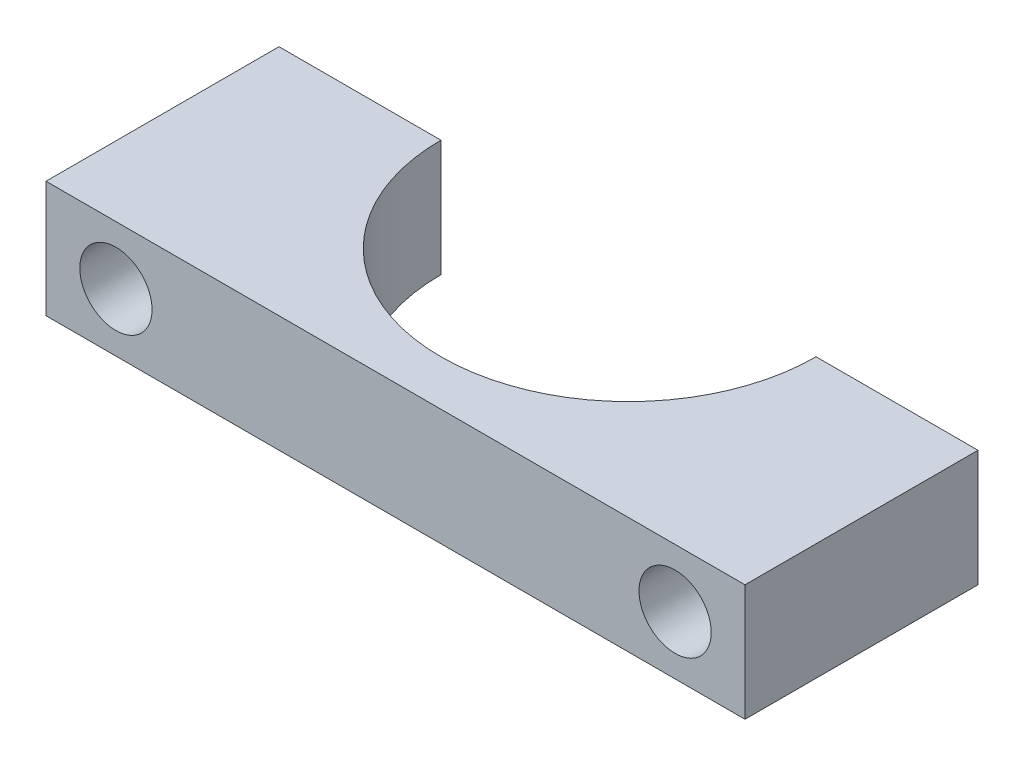
ISO-10303-21;
HEADER;
FILE_DESCRIPTION(('STEP AP214'),'2;1');
FILE_NAME('part.step','',(''),(''),'','','');
FILE_SCHEMA(('AUTOMOTIVE_DESIGN { 1 0 10303 214 1 1 1 1 }'));
ENDSEC;
DATA;
#1=APPLICATION_CONTEXT('core data for automotive mechanical design processes');
#2=APPLICATION_PROTOCOL_DEFINITION('international standard','automotive_design',2000,#1);
#3=PRODUCT_CONTEXT('',#1,'mechanical');
#4=PRODUCT('Part','Part','',(#3));
#5=PRODUCT_RELATED_PRODUCT_CATEGORY('part','',(#4));
#6=PRODUCT_DEFINITION_FORMATION('','',#4);
#7=PRODUCT_DEFINITION_CONTEXT('part definition',#1,'design');
#8=PRODUCT_DEFINITION('design','',#6,#7);
#9=PRODUCT_DEFINITION_SHAPE('','',#8);
#10=(LENGTH_UNIT() NAMED_UNIT(*) SI_UNIT(.MILLI.,.METRE.));
#11=(NAMED_UNIT(*) PLANE_ANGLE_UNIT() SI_UNIT($,.RADIAN.));
#12=(NAMED_UNIT(*) SI_UNIT($,.STERADIAN.) SOLID_ANGLE_UNIT());
#13=UNCERTAINTY_MEASURE_WITH_UNIT(LENGTH_MEASURE(1.E-05),#10,'distance_accuracy_value','');
#14=(GEOMETRIC_REPRESENTATION_CONTEXT(3) GLOBAL_UNCERTAINTY_ASSIGNED_CONTEXT((#13)) GLOBAL_UNIT_ASSIGNED_CONTEXT((#10,
#11,#12)) REPRESENTATION_CONTEXT('',''));
#15=CARTESIAN_POINT('',(0.,0.,0.));
#16=DIRECTION('',(0.,0.,1.));
#17=DIRECTION('',(1.,0.,0.));
#18=AXIS2_PLACEMENT_3D('',#15,#16,#17);
#19=CARTESIAN_POINT('',(-30.,10.,0.));
#20=DIRECTION('',(1.,0.,0.));
#21=DIRECTION('',(0.,0.,-1.));
#22=AXIS2_PLACEMENT_3D('',#19,#20,#21);
#23=PLANE('',#22);
#24=DIRECTION('',(0.,0.,1.));
#25=VECTOR('',#24,1.);
#26=CARTESIAN_POINT('',(-30.,0.,0.));
#27=LINE('',#26,#25);
#28=CARTESIAN_POINT('',(-30.,0.,0.));
#29=VERTEX_POINT('',#28);
#30=CARTESIAN_POINT('',(-30.,0.,20.));
#31=VERTEX_POINT('',#30);
#32=EDGE_CURVE('E121',#29,#31,#27,.T.);
#33=ORIENTED_EDGE('',*,*,#32,.T.);
#34=DIRECTION('',(0.,-1.,0.));
#35=VECTOR('',#34,1.);
#36=CARTESIAN_POINT('',(-30.,10.,20.));
#37=LINE('',#36,#35);
#38=CARTESIAN_POINT('',(-30.,10.,20.));
#39=VERTEX_POINT('',#38);
#40=EDGE_CURVE('E11',#39,#31,#37,.T.);
#41=ORIENTED_EDGE('',*,*,#40,.F.);
#42=DIRECTION('',(0.,0.,1.));
#43=VECTOR('',#42,1.);
#44=CARTESIAN_POINT('',(-30.,10.,0.));
#45=LINE('',#44,#43);
#46=CARTESIAN_POINT('',(-30.,10.,0.));
#47=VERTEX_POINT('',#46);
#48=EDGE_CURVE('E132',#47,#39,#45,.T.);
#49=ORIENTED_EDGE('',*,*,#48,.F.);
#50=DIRECTION('',(0.,-1.,0.));
#51=VECTOR('',#50,1.);
#52=CARTESIAN_POINT('',(-30.,10.,0.));
#53=LINE('',#52,#51);
#54=EDGE_CURVE('E117',#47,#29,#53,.T.);
#55=ORIENTED_EDGE('',*,*,#54,.T.);
#56=EDGE_LOOP('',(#33,#41,#49,#55));
#57=FACE_BOUND('',#56,.T.);
#58=ADVANCED_FACE('F37',(#57),#23,.F.);
#59=CARTESIAN_POINT('',(-30.,10.,20.));
#60=DIRECTION('',(0.,0.,-1.));
#61=DIRECTION('',(-1.,0.,0.));
#62=AXIS2_PLACEMENT_3D('',#59,#60,#61);
#63=PLANE('',#62);
#64=CARTESIAN_POINT('',(-24.,5.,20.));
#65=DIRECTION('',(0.,0.,1.));
#66=DIRECTION('',(1.,0.,0.));
#67=AXIS2_PLACEMENT_3D('',#64,#65,#66);
#68=CIRCLE('',#67,3.1);
#69=CARTESIAN_POINT('',(-20.9,5.,20.));
#70=VERTEX_POINT('',#69);
#71=EDGE_CURVE('E178',#70,#70,#68,.T.);
#72=ORIENTED_EDGE('',*,*,#71,.F.);
#73=EDGE_LOOP('',(#72));
#74=FACE_BOUND('',#73,.T.);
#75=CARTESIAN_POINT('',(24.,5.,20.));
#76=DIRECTION('',(0.,0.,1.));
#77=DIRECTION('',(1.,0.,0.));
#78=AXIS2_PLACEMENT_3D('',#75,#76,#77);
#79=CIRCLE('',#78,3.1);
#80=CARTESIAN_POINT('',(27.1,5.,20.));
#81=VERTEX_POINT('',#80);
#82=EDGE_CURVE('E179',#81,#81,#79,.T.);
#83=ORIENTED_EDGE('',*,*,#82,.F.);
#84=EDGE_LOOP('',(#83));
#85=FACE_BOUND('',#84,.T.);
#86=DIRECTION('',(1.,0.,0.));
#87=VECTOR('',#86,1.);
#88=CARTESIAN_POINT('',(-30.,0.,20.));
#89=LINE('',#88,#87);
#90=CARTESIAN_POINT('',(30.,0.,20.));
#91=VERTEX_POINT('',#90);
#92=EDGE_CURVE('E124',#31,#91,#89,.T.);
#93=ORIENTED_EDGE('',*,*,#92,.T.);
#94=DIRECTION('',(0.,-1.,0.));
#95=VECTOR('',#94,1.);
#96=CARTESIAN_POINT('',(30.,10.,20.));
#97=LINE('',#96,#95);
#98=CARTESIAN_POINT('',(30.,10.,20.));
#99=VERTEX_POINT('',#98);
#100=EDGE_CURVE('E45',#99,#91,#97,.T.);
#101=ORIENTED_EDGE('',*,*,#100,.F.);
#102=DIRECTION('',(1.,0.,0.));
#103=VECTOR('',#102,1.);
#104=CARTESIAN_POINT('',(-30.,10.,20.));
#105=LINE('',#104,#103);
#106=EDGE_CURVE('E90',#39,#99,#105,.T.);
#107=ORIENTED_EDGE('',*,*,#106,.F.);
#108=ORIENTED_EDGE('',*,*,#40,.T.);
#109=EDGE_LOOP('',(#93,#101,#107,#108));
#110=FACE_BOUND('',#109,.T.);
#111=ADVANCED_FACE('F158',(#74,#85,#110),#63,.F.);
#112=CARTESIAN_POINT('',(30.,10.,0.));
#113=DIRECTION('',(-1.,0.,0.));
#114=DIRECTION('',(0.,0.,1.));
#115=AXIS2_PLACEMENT_3D('',#112,#113,#114);
#116=PLANE('',#115);
#117=DIRECTION('',(0.,0.,-1.));
#118=VECTOR('',#117,1.);
#119=CARTESIAN_POINT('',(30.,0.,0.));
#120=LINE('',#119,#118);
#121=CARTESIAN_POINT('',(30.,0.,0.));
#122=VERTEX_POINT('',#121);
#123=EDGE_CURVE('E127',#91,#122,#120,.T.);
#124=ORIENTED_EDGE('',*,*,#123,.T.);
#125=DIRECTION('',(0.,-1.,0.));
#126=VECTOR('',#125,1.);
#127=CARTESIAN_POINT('',(30.,10.,0.));
#128=LINE('',#127,#126);
#129=CARTESIAN_POINT('',(30.,10.,0.));
#130=VERTEX_POINT('',#129);
#131=EDGE_CURVE('E112',#130,#122,#128,.T.);
#132=ORIENTED_EDGE('',*,*,#131,.F.);
#133=DIRECTION('',(0.,0.,-1.));
#134=VECTOR('',#133,1.);
#135=CARTESIAN_POINT('',(30.,10.,0.));
#136=LINE('',#135,#134);
#137=EDGE_CURVE('E103',#99,#130,#136,.T.);
#138=ORIENTED_EDGE('',*,*,#137,.F.);
#139=ORIENTED_EDGE('',*,*,#100,.T.);
#140=EDGE_LOOP('',(#124,#132,#138,#139));
#141=FACE_BOUND('',#140,.T.);
#142=ADVANCED_FACE('F138',(#141),#116,.F.);
#143=CARTESIAN_POINT('',(16.1,10.,0.));
#144=DIRECTION('',(0.,0.,1.));
#145=DIRECTION('',(1.,0.,0.));
#146=AXIS2_PLACEMENT_3D('',#143,#144,#145);
#147=PLANE('',#146);
#148=CARTESIAN_POINT('',(24.,5.,0.));
#149=DIRECTION('',(0.,0.,1.));
#150=DIRECTION('',(1.,0.,0.));
#151=AXIS2_PLACEMENT_3D('',#148,#149,#150);
#152=CIRCLE('',#151,3.1);
#153=CARTESIAN_POINT('',(27.1,5.,0.));
#154=VERTEX_POINT('',#153);
#155=EDGE_CURVE('E176',#154,#154,#152,.T.);
#156=ORIENTED_EDGE('',*,*,#155,.T.);
#157=EDGE_LOOP('',(#156));
#158=FACE_BOUND('',#157,.T.);
#159=DIRECTION('',(-1.,0.,0.));
#160=VECTOR('',#159,1.);
#161=CARTESIAN_POINT('',(16.1,0.,0.));
#162=LINE('',#161,#160);
#163=CARTESIAN_POINT('',(16.1,0.,0.));
#164=VERTEX_POINT('',#163);
#165=EDGE_CURVE('E111',#122,#164,#162,.T.);
#166=ORIENTED_EDGE('',*,*,#165,.T.);
#167=DIRECTION('',(0.,-1.,0.));
#168=VECTOR('',#167,1.);
#169=CARTESIAN_POINT('',(16.1,10.,0.));
#170=LINE('',#169,#168);
#171=CARTESIAN_POINT('',(16.1,10.,0.));
#172=VERTEX_POINT('',#171);
#173=EDGE_CURVE('E108',#172,#164,#170,.T.);
#174=ORIENTED_EDGE('',*,*,#173,.F.);
#175=DIRECTION('',(-1.,0.,0.));
#176=VECTOR('',#175,1.);
#177=CARTESIAN_POINT('',(16.1,10.,0.));
#178=LINE('',#177,#176);
#179=EDGE_CURVE('E97',#130,#172,#178,.T.);
#180=ORIENTED_EDGE('',*,*,#179,.F.);
#181=ORIENTED_EDGE('',*,*,#131,.T.);
#182=EDGE_LOOP('',(#166,#174,#180,#181));
#183=FACE_BOUND('',#182,.T.);
#184=ADVANCED_FACE('F109',(#158,#183),#147,.F.);
#185=CARTESIAN_POINT('',(0.,10.,0.));
#186=DIRECTION('',(0.,-1.,0.));
#187=DIRECTION('',(0.,0.,-1.));
#188=AXIS2_PLACEMENT_3D('',#185,#186,#187);
#189=CYLINDRICAL_SURFACE('',#188,16.1);
#190=CARTESIAN_POINT('',(0.,0.,0.));
#191=DIRECTION('',(0.,-1.,0.));
#192=DIRECTION('',(0.,0.,1.));
#193=AXIS2_PLACEMENT_3D('',#190,#191,#192);
#194=CIRCLE('',#193,16.1);
#195=CARTESIAN_POINT('',(-16.1,0.,0.));
#196=VERTEX_POINT('',#195);
#197=EDGE_CURVE('E76',#164,#196,#194,.T.);
#198=ORIENTED_EDGE('',*,*,#197,.T.);
#199=DIRECTION('',(0.,-1.,0.));
#200=VECTOR('',#199,1.);
#201=CARTESIAN_POINT('',(-16.1,10.,0.));
#202=LINE('',#201,#200);
#203=CARTESIAN_POINT('',(-16.1,10.,0.));
#204=VERTEX_POINT('',#203);
#205=EDGE_CURVE('E113',#204,#196,#202,.T.);
#206=ORIENTED_EDGE('',*,*,#205,.F.);
#207=CARTESIAN_POINT('',(0.,10.,0.));
#208=DIRECTION('',(0.,-1.,0.));
#209=DIRECTION('',(0.,0.,1.));
#210=AXIS2_PLACEMENT_3D('',#207,#208,#209);
#211=CIRCLE('',#210,16.1);
#212=EDGE_CURVE('E101',#172,#204,#211,.T.);
#213=ORIENTED_EDGE('',*,*,#212,.F.);
#214=ORIENTED_EDGE('',*,*,#173,.T.);
#215=EDGE_LOOP('',(#198,#206,#213,#214));
#216=FACE_BOUND('',#215,.T.);
#217=ADVANCED_FACE('F115',(#216),#189,.F.);
#218=CARTESIAN_POINT('',(-30.,10.,0.));
#219=DIRECTION('',(0.,0.,1.));
#220=DIRECTION('',(1.,0.,0.));
#221=AXIS2_PLACEMENT_3D('',#218,#219,#220);
#222=PLANE('',#221);
#223=CARTESIAN_POINT('',(-24.,5.,0.));
#224=DIRECTION('',(0.,0.,1.));
#225=DIRECTION('',(1.,0.,0.));
#226=AXIS2_PLACEMENT_3D('',#223,#224,#225);
#227=CIRCLE('',#226,3.1);
#228=CARTESIAN_POINT('',(-20.9,5.,0.));
#229=VERTEX_POINT('',#228);
#230=EDGE_CURVE('E125',#229,#229,#227,.T.);
#231=ORIENTED_EDGE('',*,*,#230,.T.);
#232=EDGE_LOOP('',(#231));
#233=FACE_BOUND('',#232,.T.);
#234=DIRECTION('',(-1.,0.,0.));
#235=VECTOR('',#234,1.);
#236=CARTESIAN_POINT('',(-30.,0.,0.));
#237=LINE('',#236,#235);
#238=EDGE_CURVE('E82',#196,#29,#237,.T.);
#239=ORIENTED_EDGE('',*,*,#238,.T.);
#240=ORIENTED_EDGE('',*,*,#54,.F.);
#241=DIRECTION('',(-1.,0.,0.));
#242=VECTOR('',#241,1.);
#243=CARTESIAN_POINT('',(-30.,10.,0.));
#244=LINE('',#243,#242);
#245=EDGE_CURVE('E53',#204,#47,#244,.T.);
#246=ORIENTED_EDGE('',*,*,#245,.F.);
#247=ORIENTED_EDGE('',*,*,#205,.T.);
#248=EDGE_LOOP('',(#239,#240,#246,#247));
#249=FACE_BOUND('',#248,.T.);
#250=ADVANCED_FACE('F145',(#233,#249),#222,.F.);
#251=CARTESIAN_POINT('',(0.,10.,0.));
#252=DIRECTION('',(0.,1.,0.));
#253=DIRECTION('',(0.,0.,1.));
#254=AXIS2_PLACEMENT_3D('',#251,#252,#253);
#255=PLANE('',#254);
#256=ORIENTED_EDGE('',*,*,#48,.T.);
#257=ORIENTED_EDGE('',*,*,#106,.T.);
#258=ORIENTED_EDGE('',*,*,#137,.T.);
#259=ORIENTED_EDGE('',*,*,#179,.T.);
#260=ORIENTED_EDGE('',*,*,#212,.T.);
#261=ORIENTED_EDGE('',*,*,#245,.T.);
#262=EDGE_LOOP('',(#256,#257,#258,#259,#260,#261));
#263=FACE_BOUND('',#262,.T.);
#264=ADVANCED_FACE('F99',(#263),#255,.T.);
#265=CARTESIAN_POINT('',(0.,0.,0.));
#266=DIRECTION('',(0.,1.,0.));
#267=DIRECTION('',(0.,0.,1.));
#268=AXIS2_PLACEMENT_3D('',#265,#266,#267);
#269=PLANE('',#268);
#270=ORIENTED_EDGE('',*,*,#32,.F.);
#271=ORIENTED_EDGE('',*,*,#238,.F.);
#272=ORIENTED_EDGE('',*,*,#197,.F.);
#273=ORIENTED_EDGE('',*,*,#165,.F.);
#274=ORIENTED_EDGE('',*,*,#123,.F.);
#275=ORIENTED_EDGE('',*,*,#92,.F.);
#276=EDGE_LOOP('',(#270,#271,#272,#273,#274,#275));
#277=FACE_BOUND('',#276,.T.);
#278=ADVANCED_FACE('F141',(#277),#269,.F.);
#279=CARTESIAN_POINT('',(-24.,5.,0.));
#280=DIRECTION('',(0.,0.,1.));
#281=DIRECTION('',(1.,0.,0.));
#282=AXIS2_PLACEMENT_3D('',#279,#280,#281);
#283=CYLINDRICAL_SURFACE('',#282,3.1);
#284=ORIENTED_EDGE('',*,*,#230,.F.);
#285=EDGE_LOOP('',(#284));
#286=FACE_BOUND('',#285,.T.);
#287=ORIENTED_EDGE('',*,*,#71,.T.);
#288=EDGE_LOOP('',(#287));
#289=FACE_BOUND('',#288,.T.);
#290=ADVANCED_FACE('F190',(#286,#289),#283,.F.);
#291=CARTESIAN_POINT('',(24.,5.,0.));
#292=DIRECTION('',(0.,0.,1.));
#293=DIRECTION('',(1.,0.,0.));
#294=AXIS2_PLACEMENT_3D('',#291,#292,#293);
#295=CYLINDRICAL_SURFACE('',#294,3.1);
#296=ORIENTED_EDGE('',*,*,#155,.F.);
#297=EDGE_LOOP('',(#296));
#298=FACE_BOUND('',#297,.T.);
#299=ORIENTED_EDGE('',*,*,#82,.T.);
#300=EDGE_LOOP('',(#299));
#301=FACE_BOUND('',#300,.T.);
#302=ADVANCED_FACE('F193',(#298,#301),#295,.F.);
#303=CLOSED_SHELL('',(#58,#111,#142,#184,#217,#250,#264,#278,#290,#302));
#304=MANIFOLD_SOLID_BREP('B2',#303);
#305=ADVANCED_BREP_SHAPE_REPRESENTATION('',(#18,#304),#14);
#306=SHAPE_DEFINITION_REPRESENTATION(#9,#305);
ENDSEC;
END-ISO-10303-21;
